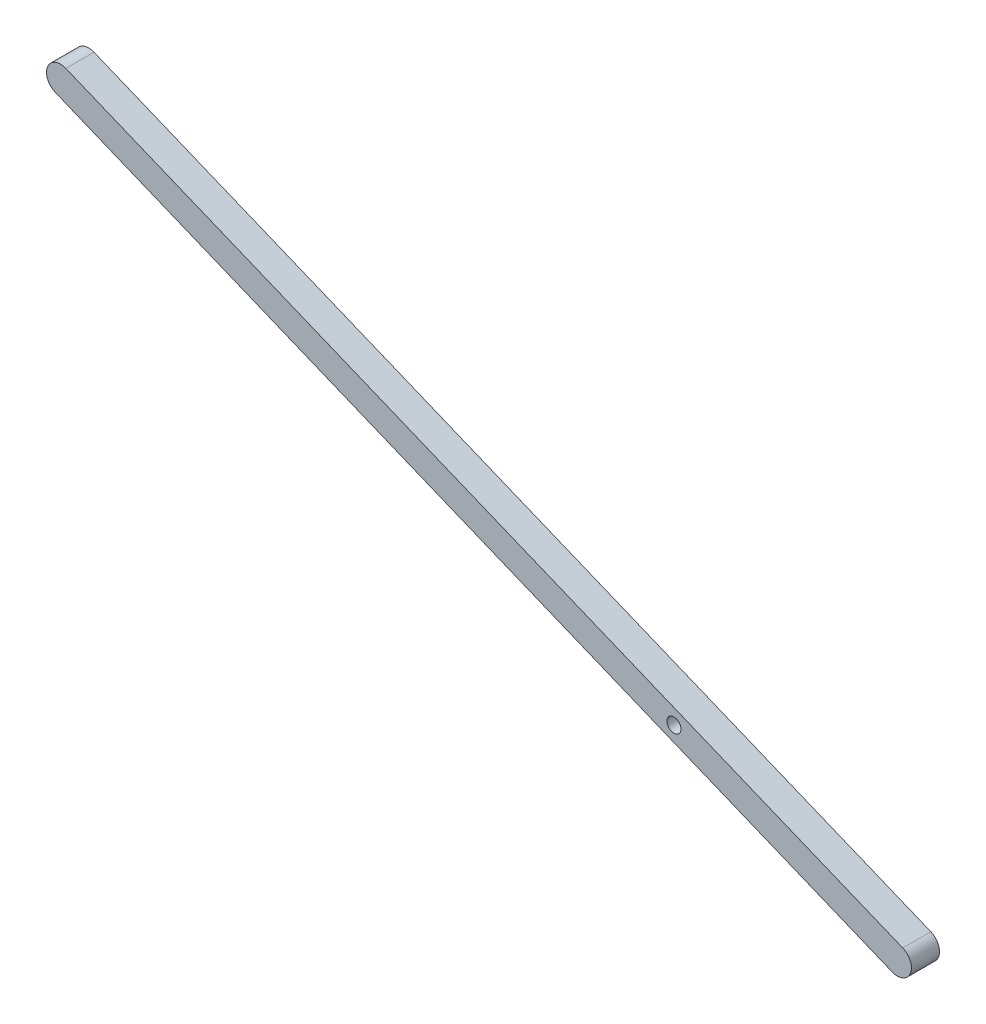
ISO-10303-21;
HEADER;
FILE_DESCRIPTION(('STEP AP214'),'2;1');
FILE_NAME('part.step','',(''),(''),'','','');
FILE_SCHEMA(('AUTOMOTIVE_DESIGN { 1 0 10303 214 1 1 1 1 }'));
ENDSEC;
DATA;
#1=APPLICATION_CONTEXT('core data for automotive mechanical design processes');
#2=APPLICATION_PROTOCOL_DEFINITION('international standard','automotive_design',2000,#1);
#3=PRODUCT_CONTEXT('',#1,'mechanical');
#4=PRODUCT('Part','Part','',(#3));
#5=PRODUCT_RELATED_PRODUCT_CATEGORY('part','',(#4));
#6=PRODUCT_DEFINITION_FORMATION('','',#4);
#7=PRODUCT_DEFINITION_CONTEXT('part definition',#1,'design');
#8=PRODUCT_DEFINITION('design','',#6,#7);
#9=PRODUCT_DEFINITION_SHAPE('','',#8);
#10=(LENGTH_UNIT() NAMED_UNIT(*) SI_UNIT(.MILLI.,.METRE.));
#11=(NAMED_UNIT(*) PLANE_ANGLE_UNIT() SI_UNIT($,.RADIAN.));
#12=(NAMED_UNIT(*) SI_UNIT($,.STERADIAN.) SOLID_ANGLE_UNIT());
#13=UNCERTAINTY_MEASURE_WITH_UNIT(LENGTH_MEASURE(1.E-05),#10,'distance_accuracy_value','');
#14=(GEOMETRIC_REPRESENTATION_CONTEXT(3) GLOBAL_UNCERTAINTY_ASSIGNED_CONTEXT((#13)) GLOBAL_UNIT_ASSIGNED_CONTEXT((#10,
#11,#12)) REPRESENTATION_CONTEXT('',''));
#15=CARTESIAN_POINT('',(0.,0.,0.));
#16=DIRECTION('',(0.,0.,1.));
#17=DIRECTION('',(1.,0.,0.));
#18=AXIS2_PLACEMENT_3D('',#15,#16,#17);
#19=CARTESIAN_POINT('',(976.376255907,120.748028339,200.));
#20=DIRECTION('',(0.379486763681779,0.925197166116677,0.));
#21=DIRECTION('',(-0.925197166116677,0.379486763681779,0.));
#22=AXIS2_PLACEMENT_3D('',#19,#20,#21);
#23=PLANE('',#22);
#24=DIRECTION('',(0.,0.,-1.));
#25=VECTOR('',#24,1.);
#26=CARTESIAN_POINT('',(976.376255906024,120.748028339308,210.));
#27=LINE('',#26,#25);
#28=CARTESIAN_POINT('',(976.376255906619,120.74802833911,200.));
#29=VERTEX_POINT('',#28);
#30=CARTESIAN_POINT('',(976.376255887408,120.748028294997,220.));
#31=VERTEX_POINT('',#30);
#32=EDGE_CURVE('E82',#29,#31,#27,.F.);
#33=ORIENTED_EDGE('',*,*,#32,.T.);
#34=DIRECTION('',(0.925197166038243,-0.379486763873002,0.));
#35=VECTOR('',#34,1.);
#36=CARTESIAN_POINT('',(380.929834142364,364.981413236411,220.));
#37=LINE('',#36,#35);
#38=CARTESIAN_POINT('',(380.929834105708,364.981413231553,220.));
#39=VERTEX_POINT('',#38);
#40=EDGE_CURVE('E59',#39,#31,#37,.T.);
#41=ORIENTED_EDGE('',*,*,#40,.F.);
#42=DIRECTION('',(0.,0.,1.));
#43=VECTOR('',#42,1.);
#44=CARTESIAN_POINT('',(380.9298341,364.981413214,210.));
#45=LINE('',#44,#43);
#46=CARTESIAN_POINT('',(380.929834099679,364.981413214131,200.));
#47=VERTEX_POINT('',#46);
#48=EDGE_CURVE('E57',#47,#39,#45,.T.);
#49=ORIENTED_EDGE('',*,*,#48,.F.);
#50=DIRECTION('',(-0.925197166116677,0.379486763681779,0.));
#51=VECTOR('',#50,1.);
#52=CARTESIAN_POINT('',(976.376255907,120.748028339,200.));
#53=LINE('',#52,#51);
#54=EDGE_CURVE('E73',#47,#29,#53,.F.);
#55=ORIENTED_EDGE('',*,*,#54,.T.);
#56=EDGE_LOOP('',(#33,#41,#49,#55));
#57=FACE_BOUND('',#56,.T.);
#58=ADVANCED_FACE('F16',(#57),#23,.F.);
#59=CARTESIAN_POINT('',(980.171123544,130.,220.));
#60=DIRECTION('',(0.,0.,-1.));
#61=DIRECTION('',(-1.,0.,0.));
#62=AXIS2_PLACEMENT_3D('',#59,#60,#61);
#63=CYLINDRICAL_SURFACE('',#62,10.);
#64=DIRECTION('',(0.,0.,1.));
#65=VECTOR('',#64,1.);
#66=CARTESIAN_POINT('',(983.965991181,139.251971661,210.));
#67=LINE('',#66,#65);
#68=CARTESIAN_POINT('',(983.96599118089,139.251971661045,200.));
#69=VERTEX_POINT('',#68);
#70=CARTESIAN_POINT('',(983.965991174864,139.251971643623,220.));
#71=VERTEX_POINT('',#70);
#72=EDGE_CURVE('E67',#69,#71,#67,.T.);
#73=ORIENTED_EDGE('',*,*,#72,.T.);
#74=CARTESIAN_POINT('',(980.171123544,130.,220.));
#75=DIRECTION('',(0.,0.,-1.));
#76=DIRECTION('',(-1.,0.,0.));
#77=AXIS2_PLACEMENT_3D('',#74,#75,#76);
#78=CIRCLE('',#77,10.);
#79=EDGE_CURVE('E71',#31,#71,#78,.F.);
#80=ORIENTED_EDGE('',*,*,#79,.F.);
#81=ORIENTED_EDGE('',*,*,#32,.F.);
#82=CARTESIAN_POINT('',(980.171123544,130.,200.));
#83=DIRECTION('',(0.,0.,-1.));
#84=DIRECTION('',(-1.,0.,0.));
#85=AXIS2_PLACEMENT_3D('',#82,#83,#84);
#86=CIRCLE('',#85,10.);
#87=EDGE_CURVE('E76',#29,#69,#86,.F.);
#88=ORIENTED_EDGE('',*,*,#87,.T.);
#89=EDGE_LOOP('',(#73,#80,#81,#88));
#90=FACE_BOUND('',#89,.T.);
#91=ADVANCED_FACE('F88',(#90),#63,.T.);
#92=CARTESIAN_POINT('',(388.519569373,383.485356536,200.));
#93=DIRECTION('',(-0.379486763681233,-0.925197166116901,0.));
#94=DIRECTION('',(0.925197166116901,-0.379486763681233,0.));
#95=AXIS2_PLACEMENT_3D('',#92,#93,#94);
#96=PLANE('',#95);
#97=DIRECTION('',(0.,0.,-1.));
#98=VECTOR('',#97,1.);
#99=CARTESIAN_POINT('',(388.519569370181,383.485356537248,210.));
#100=LINE('',#99,#98);
#101=CARTESIAN_POINT('',(388.51956937148,383.485356536669,200.));
#102=VERTEX_POINT('',#101);
#103=CARTESIAN_POINT('',(388.519569390766,383.485356580957,220.));
#104=VERTEX_POINT('',#103);
#105=EDGE_CURVE('E35',#102,#104,#100,.F.);
#106=ORIENTED_EDGE('',*,*,#105,.T.);
#107=DIRECTION('',(-0.925197166038243,0.379486763873002,0.));
#108=VECTOR('',#107,1.);
#109=CARTESIAN_POINT('',(983.965991138636,139.251971638589,220.));
#110=LINE('',#109,#108);
#111=EDGE_CURVE('E64',#71,#104,#110,.T.);
#112=ORIENTED_EDGE('',*,*,#111,.F.);
#113=ORIENTED_EDGE('',*,*,#72,.F.);
#114=DIRECTION('',(0.925197166116901,-0.379486763681233,0.));
#115=VECTOR('',#114,1.);
#116=CARTESIAN_POINT('',(388.519569373,383.485356536,200.));
#117=LINE('',#116,#115);
#118=EDGE_CURVE('E66',#69,#102,#117,.F.);
#119=ORIENTED_EDGE('',*,*,#118,.T.);
#120=EDGE_LOOP('',(#106,#112,#113,#119));
#121=FACE_BOUND('',#120,.T.);
#122=ADVANCED_FACE('F63',(#121),#96,.F.);
#123=CARTESIAN_POINT('',(384.724701736,374.233384875,220.));
#124=DIRECTION('',(0.,0.,-1.));
#125=DIRECTION('',(-1.,0.,0.));
#126=AXIS2_PLACEMENT_3D('',#123,#124,#125);
#127=CYLINDRICAL_SURFACE('',#126,10.);
#128=CARTESIAN_POINT('',(384.724701736,374.233384875,220.));
#129=DIRECTION('',(0.,0.,-1.));
#130=DIRECTION('',(-1.,0.,0.));
#131=AXIS2_PLACEMENT_3D('',#128,#129,#130);
#132=CIRCLE('',#131,10.);
#133=EDGE_CURVE('E20',#104,#39,#132,.F.);
#134=ORIENTED_EDGE('',*,*,#133,.F.);
#135=ORIENTED_EDGE('',*,*,#105,.F.);
#136=CARTESIAN_POINT('',(384.724701736,374.233384875,200.));
#137=DIRECTION('',(0.,0.,-1.));
#138=DIRECTION('',(-1.,0.,0.));
#139=AXIS2_PLACEMENT_3D('',#136,#137,#138);
#140=CIRCLE('',#139,10.);
#141=EDGE_CURVE('E94',#102,#47,#140,.F.);
#142=ORIENTED_EDGE('',*,*,#141,.T.);
#143=ORIENTED_EDGE('',*,*,#48,.T.);
#144=EDGE_LOOP('',(#134,#135,#142,#143));
#145=FACE_BOUND('',#144,.T.);
#146=ADVANCED_FACE('F55',(#145),#127,.T.);
#147=CARTESIAN_POINT('',(371.032023206,118.414599691,220.));
#148=DIRECTION('',(0.,0.,1.));
#149=DIRECTION('',(1.,0.,0.));
#150=AXIS2_PLACEMENT_3D('',#147,#148,#149);
#151=PLANE('',#150);
#152=CARTESIAN_POINT('',(821.227487558,195.193677885,220.));
#153=DIRECTION('',(0.,0.,-1.));
#154=DIRECTION('',(-1.,0.,0.));
#155=AXIS2_PLACEMENT_3D('',#152,#153,#154);
#156=CIRCLE('',#155,5.);
#157=CARTESIAN_POINT('',(816.227487558,195.193677885,220.));
#158=VERTEX_POINT('',#157);
#159=EDGE_CURVE('E26',#158,#158,#156,.F.);
#160=ORIENTED_EDGE('',*,*,#159,.F.);
#161=EDGE_LOOP('',(#160));
#162=FACE_BOUND('',#161,.T.);
#163=ORIENTED_EDGE('',*,*,#79,.T.);
#164=ORIENTED_EDGE('',*,*,#111,.T.);
#165=ORIENTED_EDGE('',*,*,#133,.T.);
#166=ORIENTED_EDGE('',*,*,#40,.T.);
#167=EDGE_LOOP('',(#163,#164,#165,#166));
#168=FACE_BOUND('',#167,.T.);
#169=ADVANCED_FACE('F69',(#162,#168),#151,.T.);
#170=CARTESIAN_POINT('',(371.032023206,118.414599691,200.));
#171=DIRECTION('',(0.,0.,1.));
#172=DIRECTION('',(1.,0.,0.));
#173=AXIS2_PLACEMENT_3D('',#170,#171,#172);
#174=PLANE('',#173);
#175=CARTESIAN_POINT('',(821.227487558,195.193677885,200.));
#176=DIRECTION('',(0.,0.,-1.));
#177=DIRECTION('',(-1.,0.,0.));
#178=AXIS2_PLACEMENT_3D('',#175,#176,#177);
#179=CIRCLE('',#178,5.);
#180=CARTESIAN_POINT('',(816.227487558,195.193677885,200.));
#181=VERTEX_POINT('',#180);
#182=EDGE_CURVE('E10',#181,#181,#179,.T.);
#183=ORIENTED_EDGE('',*,*,#182,.F.);
#184=EDGE_LOOP('',(#183));
#185=FACE_BOUND('',#184,.T.);
#186=ORIENTED_EDGE('',*,*,#118,.F.);
#187=ORIENTED_EDGE('',*,*,#87,.F.);
#188=ORIENTED_EDGE('',*,*,#54,.F.);
#189=ORIENTED_EDGE('',*,*,#141,.F.);
#190=EDGE_LOOP('',(#186,#187,#188,#189));
#191=FACE_BOUND('',#190,.T.);
#192=ADVANCED_FACE('F18',(#185,#191),#174,.F.);
#193=CARTESIAN_POINT('',(821.227487558,195.193677885,220.));
#194=DIRECTION('',(0.,0.,-1.));
#195=DIRECTION('',(-1.,0.,0.));
#196=AXIS2_PLACEMENT_3D('',#193,#194,#195);
#197=CYLINDRICAL_SURFACE('',#196,5.);
#198=ORIENTED_EDGE('',*,*,#182,.T.);
#199=EDGE_LOOP('',(#198));
#200=FACE_BOUND('',#199,.T.);
#201=ORIENTED_EDGE('',*,*,#159,.T.);
#202=EDGE_LOOP('',(#201));
#203=FACE_BOUND('',#202,.T.);
#204=ADVANCED_FACE('F98',(#200,#203),#197,.F.);
#205=CLOSED_SHELL('',(#58,#91,#122,#146,#169,#192,#204));
#206=MANIFOLD_SOLID_BREP('B1',#205);
#207=ADVANCED_BREP_SHAPE_REPRESENTATION('',(#18,#206),#14);
#208=SHAPE_DEFINITION_REPRESENTATION(#9,#207);
ENDSEC;
END-ISO-10303-21;
